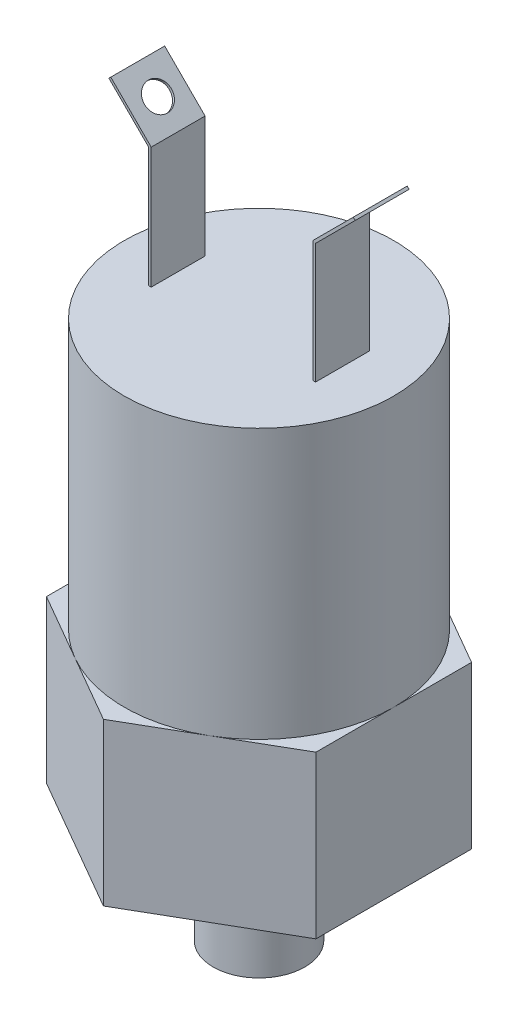
ISO-10303-21;
HEADER;
FILE_DESCRIPTION(('STEP AP214'),'2;1');
FILE_NAME('part.step','',(''),(''),'','','');
FILE_SCHEMA(('AUTOMOTIVE_DESIGN { 1 0 10303 214 1 1 1 1 }'));
ENDSEC;
DATA;
#1=APPLICATION_CONTEXT('core data for automotive mechanical design processes');
#2=APPLICATION_PROTOCOL_DEFINITION('international standard','automotive_design',2000,#1);
#3=PRODUCT_CONTEXT('',#1,'mechanical');
#4=PRODUCT('Part','Part','',(#3));
#5=PRODUCT_RELATED_PRODUCT_CATEGORY('part','',(#4));
#6=PRODUCT_DEFINITION_FORMATION('','',#4);
#7=PRODUCT_DEFINITION_CONTEXT('part definition',#1,'design');
#8=PRODUCT_DEFINITION('design','',#6,#7);
#9=PRODUCT_DEFINITION_SHAPE('','',#8);
#10=(LENGTH_UNIT() NAMED_UNIT(*) SI_UNIT(.MILLI.,.METRE.));
#11=(NAMED_UNIT(*) PLANE_ANGLE_UNIT() SI_UNIT($,.RADIAN.));
#12=(NAMED_UNIT(*) SI_UNIT($,.STERADIAN.) SOLID_ANGLE_UNIT());
#13=UNCERTAINTY_MEASURE_WITH_UNIT(LENGTH_MEASURE(1.E-05),#10,'distance_accuracy_value','');
#14=(GEOMETRIC_REPRESENTATION_CONTEXT(3) GLOBAL_UNCERTAINTY_ASSIGNED_CONTEXT((#13)) GLOBAL_UNIT_ASSIGNED_CONTEXT((#10,
#11,#12)) REPRESENTATION_CONTEXT('',''));
#15=CARTESIAN_POINT('',(0.,0.,0.));
#16=DIRECTION('',(0.,0.,1.));
#17=DIRECTION('',(1.,0.,0.));
#18=AXIS2_PLACEMENT_3D('',#15,#16,#17);
#19=CARTESIAN_POINT('',(0.,50.8,0.));
#20=DIRECTION('',(0.,1.,0.));
#21=DIRECTION('',(0.,0.,1.));
#22=AXIS2_PLACEMENT_3D('',#19,#20,#21);
#23=PLANE('',#22);
#24=CARTESIAN_POINT('',(0.,50.8,0.));
#25=DIRECTION('',(0.,1.,0.));
#26=DIRECTION('',(0.,0.,1.));
#27=AXIS2_PLACEMENT_3D('',#24,#25,#26);
#28=CIRCLE('',#27,12.7);
#29=CARTESIAN_POINT('',(0.,50.8,12.7));
#30=VERTEX_POINT('',#29);
#31=EDGE_CURVE('E284',#30,#30,#28,.T.);
#32=ORIENTED_EDGE('',*,*,#31,.T.);
#33=EDGE_LOOP('',(#32));
#34=FACE_BOUND('',#33,.T.);
#35=DIRECTION('',(0.,0.,-1.));
#36=VECTOR('',#35,1.);
#37=CARTESIAN_POINT('',(7.874,50.8,2.54));
#38=LINE('',#37,#36);
#39=CARTESIAN_POINT('',(7.874,50.8,2.54));
#40=VERTEX_POINT('',#39);
#41=CARTESIAN_POINT('',(7.874,50.8,-2.54));
#42=VERTEX_POINT('',#41);
#43=EDGE_CURVE('E273',#40,#42,#38,.T.);
#44=ORIENTED_EDGE('',*,*,#43,.F.);
#45=DIRECTION('',(-1.,0.,0.));
#46=VECTOR('',#45,1.);
#47=CARTESIAN_POINT('',(7.874,50.8,2.54));
#48=LINE('',#47,#46);
#49=CARTESIAN_POINT('',(7.62,50.8,2.54));
#50=VERTEX_POINT('',#49);
#51=EDGE_CURVE('E251',#40,#50,#48,.T.);
#52=ORIENTED_EDGE('',*,*,#51,.T.);
#53=DIRECTION('',(0.,0.,-1.));
#54=VECTOR('',#53,1.);
#55=CARTESIAN_POINT('',(7.62,50.8,2.54));
#56=LINE('',#55,#54);
#57=CARTESIAN_POINT('',(7.62,50.8,-2.54));
#58=VERTEX_POINT('',#57);
#59=EDGE_CURVE('E276',#50,#58,#56,.T.);
#60=ORIENTED_EDGE('',*,*,#59,.T.);
#61=DIRECTION('',(-1.,0.,0.));
#62=VECTOR('',#61,1.);
#63=CARTESIAN_POINT('',(7.874,50.8,-2.54));
#64=LINE('',#63,#62);
#65=EDGE_CURVE('E267',#42,#58,#64,.T.);
#66=ORIENTED_EDGE('',*,*,#65,.F.);
#67=EDGE_LOOP('',(#44,#52,#60,#66));
#68=FACE_BOUND('',#67,.T.);
#69=DIRECTION('',(0.,0.,-1.));
#70=VECTOR('',#69,1.);
#71=CARTESIAN_POINT('',(-7.62,50.8,2.54));
#72=LINE('',#71,#70);
#73=CARTESIAN_POINT('',(-7.62,50.8,2.54));
#74=VERTEX_POINT('',#73);
#75=CARTESIAN_POINT('',(-7.62,50.8,-2.54));
#76=VERTEX_POINT('',#75);
#77=EDGE_CURVE('E58',#74,#76,#72,.T.);
#78=ORIENTED_EDGE('',*,*,#77,.F.);
#79=DIRECTION('',(1.,0.,0.));
#80=VECTOR('',#79,1.);
#81=CARTESIAN_POINT('',(-7.874,50.8,2.54));
#82=LINE('',#81,#80);
#83=CARTESIAN_POINT('',(-7.874,50.8,2.54));
#84=VERTEX_POINT('',#83);
#85=EDGE_CURVE('E53',#84,#74,#82,.T.);
#86=ORIENTED_EDGE('',*,*,#85,.F.);
#87=DIRECTION('',(0.,0.,-1.));
#88=VECTOR('',#87,1.);
#89=CARTESIAN_POINT('',(-7.874,50.8,2.54));
#90=LINE('',#89,#88);
#91=CARTESIAN_POINT('',(-7.874,50.8,-2.54));
#92=VERTEX_POINT('',#91);
#93=EDGE_CURVE('E190',#84,#92,#90,.T.);
#94=ORIENTED_EDGE('',*,*,#93,.T.);
#95=DIRECTION('',(1.,0.,0.));
#96=VECTOR('',#95,1.);
#97=CARTESIAN_POINT('',(-7.874,50.8,-2.54));
#98=LINE('',#97,#96);
#99=EDGE_CURVE('E216',#92,#76,#98,.T.);
#100=ORIENTED_EDGE('',*,*,#99,.T.);
#101=EDGE_LOOP('',(#78,#86,#94,#100));
#102=FACE_BOUND('',#101,.T.);
#103=ADVANCED_FACE('F35',(#34,#68,#102),#23,.T.);
#104=CARTESIAN_POINT('',(0.,25.4,0.));
#105=DIRECTION('',(0.,1.,0.));
#106=DIRECTION('',(0.,0.,1.));
#107=AXIS2_PLACEMENT_3D('',#104,#105,#106);
#108=PLANE('',#107);
#109=CARTESIAN_POINT('',(0.,25.4,0.));
#110=DIRECTION('',(0.,1.,0.));
#111=DIRECTION('',(0.,0.,1.));
#112=AXIS2_PLACEMENT_3D('',#109,#110,#111);
#113=CIRCLE('',#112,12.7);
#114=CARTESIAN_POINT('',(6.35,25.4,10.9985226280624));
#115=VERTEX_POINT('',#114);
#116=CARTESIAN_POINT('',(12.7,25.4,0.));
#117=VERTEX_POINT('',#116);
#118=EDGE_CURVE('E46',#115,#117,#113,.T.);
#119=ORIENTED_EDGE('',*,*,#118,.F.);
#120=DIRECTION('',(0.866025403784439,0.,-0.5));
#121=VECTOR('',#120,1.);
#122=CARTESIAN_POINT('',(0.,25.4,14.6646968374165));
#123=LINE('',#122,#121);
#124=CARTESIAN_POINT('',(12.7,25.4,7.33234841870824));
#125=VERTEX_POINT('',#124);
#126=EDGE_CURVE('E306',#115,#125,#123,.T.);
#127=ORIENTED_EDGE('',*,*,#126,.T.);
#128=DIRECTION('',(0.,0.,-1.));
#129=VECTOR('',#128,1.);
#130=CARTESIAN_POINT('',(12.7,25.4,7.33234841870824));
#131=LINE('',#130,#129);
#132=EDGE_CURVE('E310',#125,#117,#131,.T.);
#133=ORIENTED_EDGE('',*,*,#132,.T.);
#134=EDGE_LOOP('',(#119,#127,#133));
#135=FACE_BOUND('',#134,.T.);
#136=ADVANCED_FACE('F365',(#135),#108,.T.);
#137=CARTESIAN_POINT('',(6.35,25.4,-10.9985226280624));
#138=VERTEX_POINT('',#137);
#139=EDGE_CURVE('E11',#117,#138,#113,.T.);
#140=ORIENTED_EDGE('',*,*,#139,.F.);
#141=CARTESIAN_POINT('',(12.7,25.4,-7.33234841870825));
#142=VERTEX_POINT('',#141);
#143=EDGE_CURVE('E309',#117,#142,#131,.T.);
#144=ORIENTED_EDGE('',*,*,#143,.T.);
#145=DIRECTION('',(-0.866025403784439,0.,-0.5));
#146=VECTOR('',#145,1.);
#147=CARTESIAN_POINT('',(12.7,25.4,-7.33234841870825));
#148=LINE('',#147,#146);
#149=EDGE_CURVE('E290',#142,#138,#148,.T.);
#150=ORIENTED_EDGE('',*,*,#149,.T.);
#151=EDGE_LOOP('',(#140,#144,#150));
#152=FACE_BOUND('',#151,.T.);
#153=ADVANCED_FACE('F371',(#152),#108,.T.);
#154=CARTESIAN_POINT('',(-6.35,25.4,-10.9985226280624));
#155=VERTEX_POINT('',#154);
#156=EDGE_CURVE('E44',#138,#155,#113,.T.);
#157=ORIENTED_EDGE('',*,*,#156,.F.);
#158=CARTESIAN_POINT('',(0.,25.4,-14.6646968374165));
#159=VERTEX_POINT('',#158);
#160=EDGE_CURVE('E294',#138,#159,#148,.T.);
#161=ORIENTED_EDGE('',*,*,#160,.T.);
#162=DIRECTION('',(-0.866025403784438,0.,0.5));
#163=VECTOR('',#162,1.);
#164=CARTESIAN_POINT('',(0.,25.4,-14.6646968374165));
#165=LINE('',#164,#163);
#166=EDGE_CURVE('E295',#159,#155,#165,.T.);
#167=ORIENTED_EDGE('',*,*,#166,.T.);
#168=EDGE_LOOP('',(#157,#161,#167));
#169=FACE_BOUND('',#168,.T.);
#170=ADVANCED_FACE('F437',(#169),#108,.T.);
#171=CARTESIAN_POINT('',(-12.7,25.4,0.));
#172=VERTEX_POINT('',#171);
#173=EDGE_CURVE('E434',#155,#172,#113,.T.);
#174=ORIENTED_EDGE('',*,*,#173,.F.);
#175=CARTESIAN_POINT('',(-12.7,25.4,-7.33234841870824));
#176=VERTEX_POINT('',#175);
#177=EDGE_CURVE('E293',#155,#176,#165,.T.);
#178=ORIENTED_EDGE('',*,*,#177,.T.);
#179=DIRECTION('',(0.,0.,1.));
#180=VECTOR('',#179,1.);
#181=CARTESIAN_POINT('',(-12.7,25.4,-7.33234841870824));
#182=LINE('',#181,#180);
#183=EDGE_CURVE('E299',#176,#172,#182,.T.);
#184=ORIENTED_EDGE('',*,*,#183,.T.);
#185=EDGE_LOOP('',(#174,#178,#184));
#186=FACE_BOUND('',#185,.T.);
#187=ADVANCED_FACE('F447',(#186),#108,.T.);
#188=CARTESIAN_POINT('',(-6.35,25.4,10.9985226280624));
#189=VERTEX_POINT('',#188);
#190=EDGE_CURVE('E347',#172,#189,#113,.T.);
#191=ORIENTED_EDGE('',*,*,#190,.F.);
#192=CARTESIAN_POINT('',(-12.7,25.4,7.33234841870825));
#193=VERTEX_POINT('',#192);
#194=EDGE_CURVE('E298',#172,#193,#182,.T.);
#195=ORIENTED_EDGE('',*,*,#194,.T.);
#196=DIRECTION('',(0.866025403784439,0.,0.5));
#197=VECTOR('',#196,1.);
#198=CARTESIAN_POINT('',(-12.7,25.4,7.33234841870825));
#199=LINE('',#198,#197);
#200=EDGE_CURVE('E303',#193,#189,#199,.T.);
#201=ORIENTED_EDGE('',*,*,#200,.T.);
#202=EDGE_LOOP('',(#191,#195,#201));
#203=FACE_BOUND('',#202,.T.);
#204=ADVANCED_FACE('F362',(#203),#108,.T.);
#205=CARTESIAN_POINT('',(0.,10.16,0.));
#206=DIRECTION('',(0.,-1.,0.));
#207=DIRECTION('',(0.,0.,-1.));
#208=AXIS2_PLACEMENT_3D('',#205,#206,#207);
#209=CYLINDRICAL_SURFACE('',#208,4.318);
#210=CARTESIAN_POINT('',(0.,10.16,0.));
#211=DIRECTION('',(0.,1.,0.));
#212=DIRECTION('',(0.,0.,1.));
#213=AXIS2_PLACEMENT_3D('',#210,#211,#212);
#214=CIRCLE('',#213,4.318);
#215=CARTESIAN_POINT('',(0.,10.16,4.318));
#216=VERTEX_POINT('',#215);
#217=EDGE_CURVE('E342',#216,#216,#214,.T.);
#218=ORIENTED_EDGE('',*,*,#217,.F.);
#219=EDGE_LOOP('',(#218));
#220=FACE_BOUND('',#219,.T.);
#221=CARTESIAN_POINT('',(0.,0.,0.));
#222=DIRECTION('',(0.,1.,0.));
#223=DIRECTION('',(0.,0.,1.));
#224=AXIS2_PLACEMENT_3D('',#221,#222,#223);
#225=CIRCLE('',#224,4.318);
#226=CARTESIAN_POINT('',(0.,0.,4.318));
#227=VERTEX_POINT('',#226);
#228=EDGE_CURVE('E39',#227,#227,#225,.T.);
#229=ORIENTED_EDGE('',*,*,#228,.T.);
#230=EDGE_LOOP('',(#229));
#231=FACE_BOUND('',#230,.T.);
#232=ADVANCED_FACE('F37',(#220,#231),#209,.T.);
#233=CARTESIAN_POINT('',(0.,0.,0.));
#234=DIRECTION('',(0.,1.,0.));
#235=DIRECTION('',(0.,0.,1.));
#236=AXIS2_PLACEMENT_3D('',#233,#234,#235);
#237=PLANE('',#236);
#238=ORIENTED_EDGE('',*,*,#228,.F.);
#239=EDGE_LOOP('',(#238));
#240=FACE_BOUND('',#239,.T.);
#241=ADVANCED_FACE('F352',(#240),#237,.F.);
#242=CARTESIAN_POINT('',(12.7,25.4,-7.33234841870825));
#243=DIRECTION('',(-0.5,0.,0.866025403784439));
#244=DIRECTION('',(0.866025403784439,0.,0.5));
#245=AXIS2_PLACEMENT_3D('',#242,#243,#244);
#246=PLANE('',#245);
#247=DIRECTION('',(-0.866025403784439,0.,-0.5));
#248=VECTOR('',#247,1.);
#249=CARTESIAN_POINT('',(12.7,10.16,-7.33234841870825));
#250=LINE('',#249,#248);
#251=CARTESIAN_POINT('',(12.7,10.16,-7.33234841870825));
#252=VERTEX_POINT('',#251);
#253=CARTESIAN_POINT('',(0.,10.16,-14.6646968374165));
#254=VERTEX_POINT('',#253);
#255=EDGE_CURVE('E286',#252,#254,#250,.T.);
#256=ORIENTED_EDGE('',*,*,#255,.T.);
#257=DIRECTION('',(0.,-1.,0.));
#258=VECTOR('',#257,1.);
#259=CARTESIAN_POINT('',(0.,25.4,-14.6646968374165));
#260=LINE('',#259,#258);
#261=EDGE_CURVE('E340',#159,#254,#260,.T.);
#262=ORIENTED_EDGE('',*,*,#261,.F.);
#263=ORIENTED_EDGE('',*,*,#160,.F.);
#264=ORIENTED_EDGE('',*,*,#149,.F.);
#265=DIRECTION('',(0.,-1.,0.));
#266=VECTOR('',#265,1.);
#267=CARTESIAN_POINT('',(12.7,25.4,-7.33234841870825));
#268=LINE('',#267,#266);
#269=EDGE_CURVE('E313',#142,#252,#268,.T.);
#270=ORIENTED_EDGE('',*,*,#269,.T.);
#271=EDGE_LOOP('',(#256,#262,#263,#264,#270));
#272=FACE_BOUND('',#271,.T.);
#273=ADVANCED_FACE('F354',(#272),#246,.F.);
#274=CARTESIAN_POINT('',(0.,25.4,-14.6646968374165));
#275=DIRECTION('',(0.5,0.,0.866025403784438));
#276=DIRECTION('',(0.866025403784439,0.,-0.5));
#277=AXIS2_PLACEMENT_3D('',#274,#275,#276);
#278=PLANE('',#277);
#279=DIRECTION('',(-0.866025403784438,0.,0.5));
#280=VECTOR('',#279,1.);
#281=CARTESIAN_POINT('',(0.,10.16,-14.6646968374165));
#282=LINE('',#281,#280);
#283=CARTESIAN_POINT('',(-12.7,10.16,-7.33234841870824));
#284=VERTEX_POINT('',#283);
#285=EDGE_CURVE('E316',#254,#284,#282,.T.);
#286=ORIENTED_EDGE('',*,*,#285,.T.);
#287=DIRECTION('',(0.,-1.,0.));
#288=VECTOR('',#287,1.);
#289=CARTESIAN_POINT('',(-12.7,25.4,-7.33234841870824));
#290=LINE('',#289,#288);
#291=EDGE_CURVE('E337',#176,#284,#290,.T.);
#292=ORIENTED_EDGE('',*,*,#291,.F.);
#293=ORIENTED_EDGE('',*,*,#177,.F.);
#294=ORIENTED_EDGE('',*,*,#166,.F.);
#295=ORIENTED_EDGE('',*,*,#261,.T.);
#296=EDGE_LOOP('',(#286,#292,#293,#294,#295));
#297=FACE_BOUND('',#296,.T.);
#298=ADVANCED_FACE('F359',(#297),#278,.F.);
#299=CARTESIAN_POINT('',(-12.7,25.4,-7.33234841870824));
#300=DIRECTION('',(1.,0.,0.));
#301=DIRECTION('',(0.,0.,-1.));
#302=AXIS2_PLACEMENT_3D('',#299,#300,#301);
#303=PLANE('',#302);
#304=DIRECTION('',(0.,0.,1.));
#305=VECTOR('',#304,1.);
#306=CARTESIAN_POINT('',(-12.7,10.16,-7.33234841870824));
#307=LINE('',#306,#305);
#308=CARTESIAN_POINT('',(-12.7,10.16,7.33234841870825));
#309=VERTEX_POINT('',#308);
#310=EDGE_CURVE('E318',#284,#309,#307,.T.);
#311=ORIENTED_EDGE('',*,*,#310,.T.);
#312=DIRECTION('',(0.,-1.,0.));
#313=VECTOR('',#312,1.);
#314=CARTESIAN_POINT('',(-12.7,25.4,7.33234841870825));
#315=LINE('',#314,#313);
#316=EDGE_CURVE('E334',#193,#309,#315,.T.);
#317=ORIENTED_EDGE('',*,*,#316,.F.);
#318=ORIENTED_EDGE('',*,*,#194,.F.);
#319=ORIENTED_EDGE('',*,*,#183,.F.);
#320=ORIENTED_EDGE('',*,*,#291,.T.);
#321=EDGE_LOOP('',(#311,#317,#318,#319,#320));
#322=FACE_BOUND('',#321,.T.);
#323=ADVANCED_FACE('F400',(#322),#303,.F.);
#324=CARTESIAN_POINT('',(-12.7,25.4,7.33234841870825));
#325=DIRECTION('',(0.5,0.,-0.866025403784439));
#326=DIRECTION('',(-0.866025403784439,0.,-0.5));
#327=AXIS2_PLACEMENT_3D('',#324,#325,#326);
#328=PLANE('',#327);
#329=DIRECTION('',(0.866025403784439,0.,0.5));
#330=VECTOR('',#329,1.);
#331=CARTESIAN_POINT('',(-12.7,10.16,7.33234841870825));
#332=LINE('',#331,#330);
#333=CARTESIAN_POINT('',(0.,10.16,14.6646968374165));
#334=VERTEX_POINT('',#333);
#335=EDGE_CURVE('E320',#309,#334,#332,.T.);
#336=ORIENTED_EDGE('',*,*,#335,.T.);
#337=DIRECTION('',(0.,-1.,0.));
#338=VECTOR('',#337,1.);
#339=CARTESIAN_POINT('',(0.,25.4,14.6646968374165));
#340=LINE('',#339,#338);
#341=CARTESIAN_POINT('',(0.,25.4,14.6646968374165));
#342=VERTEX_POINT('',#341);
#343=EDGE_CURVE('E331',#342,#334,#340,.T.);
#344=ORIENTED_EDGE('',*,*,#343,.F.);
#345=EDGE_CURVE('E302',#189,#342,#199,.T.);
#346=ORIENTED_EDGE('',*,*,#345,.F.);
#347=ORIENTED_EDGE('',*,*,#200,.F.);
#348=ORIENTED_EDGE('',*,*,#316,.T.);
#349=EDGE_LOOP('',(#336,#344,#346,#347,#348));
#350=FACE_BOUND('',#349,.T.);
#351=ADVANCED_FACE('F396',(#350),#328,.F.);
#352=CARTESIAN_POINT('',(0.,25.4,14.6646968374165));
#353=DIRECTION('',(-0.5,0.,-0.866025403784439));
#354=DIRECTION('',(-0.866025403784439,0.,0.5));
#355=AXIS2_PLACEMENT_3D('',#352,#353,#354);
#356=PLANE('',#355);
#357=DIRECTION('',(0.866025403784439,0.,-0.5));
#358=VECTOR('',#357,1.);
#359=CARTESIAN_POINT('',(0.,10.16,14.6646968374165));
#360=LINE('',#359,#358);
#361=CARTESIAN_POINT('',(12.7,10.16,7.33234841870824));
#362=VERTEX_POINT('',#361);
#363=EDGE_CURVE('E322',#334,#362,#360,.T.);
#364=ORIENTED_EDGE('',*,*,#363,.T.);
#365=DIRECTION('',(0.,-1.,0.));
#366=VECTOR('',#365,1.);
#367=CARTESIAN_POINT('',(12.7,25.4,7.33234841870824));
#368=LINE('',#367,#366);
#369=EDGE_CURVE('E328',#125,#362,#368,.T.);
#370=ORIENTED_EDGE('',*,*,#369,.F.);
#371=ORIENTED_EDGE('',*,*,#126,.F.);
#372=EDGE_CURVE('E307',#342,#115,#123,.T.);
#373=ORIENTED_EDGE('',*,*,#372,.F.);
#374=ORIENTED_EDGE('',*,*,#343,.T.);
#375=EDGE_LOOP('',(#364,#370,#371,#373,#374));
#376=FACE_BOUND('',#375,.T.);
#377=ADVANCED_FACE('F392',(#376),#356,.F.);
#378=CARTESIAN_POINT('',(12.7,25.4,7.33234841870824));
#379=DIRECTION('',(-1.,0.,0.));
#380=DIRECTION('',(0.,0.,1.));
#381=AXIS2_PLACEMENT_3D('',#378,#379,#380);
#382=PLANE('',#381);
#383=DIRECTION('',(0.,0.,-1.));
#384=VECTOR('',#383,1.);
#385=CARTESIAN_POINT('',(12.7,10.16,7.33234841870824));
#386=LINE('',#385,#384);
#387=EDGE_CURVE('E324',#362,#252,#386,.T.);
#388=ORIENTED_EDGE('',*,*,#387,.T.);
#389=ORIENTED_EDGE('',*,*,#269,.F.);
#390=ORIENTED_EDGE('',*,*,#143,.F.);
#391=ORIENTED_EDGE('',*,*,#132,.F.);
#392=ORIENTED_EDGE('',*,*,#369,.T.);
#393=EDGE_LOOP('',(#388,#389,#390,#391,#392));
#394=FACE_BOUND('',#393,.T.);
#395=ADVANCED_FACE('F386',(#394),#382,.F.);
#396=EDGE_CURVE('E289',#189,#115,#113,.T.);
#397=ORIENTED_EDGE('',*,*,#396,.F.);
#398=ORIENTED_EDGE('',*,*,#345,.T.);
#399=ORIENTED_EDGE('',*,*,#372,.T.);
#400=EDGE_LOOP('',(#397,#398,#399));
#401=FACE_BOUND('',#400,.T.);
#402=ADVANCED_FACE('F374',(#401),#108,.T.);
#403=CARTESIAN_POINT('',(0.,10.16,0.));
#404=DIRECTION('',(0.,1.,0.));
#405=DIRECTION('',(0.,0.,1.));
#406=AXIS2_PLACEMENT_3D('',#403,#404,#405);
#407=PLANE('',#406);
#408=ORIENTED_EDGE('',*,*,#217,.T.);
#409=EDGE_LOOP('',(#408));
#410=FACE_BOUND('',#409,.T.);
#411=ORIENTED_EDGE('',*,*,#255,.F.);
#412=ORIENTED_EDGE('',*,*,#387,.F.);
#413=ORIENTED_EDGE('',*,*,#363,.F.);
#414=ORIENTED_EDGE('',*,*,#335,.F.);
#415=ORIENTED_EDGE('',*,*,#310,.F.);
#416=ORIENTED_EDGE('',*,*,#285,.F.);
#417=EDGE_LOOP('',(#411,#412,#413,#414,#415,#416));
#418=FACE_BOUND('',#417,.T.);
#419=ADVANCED_FACE('F382',(#410,#418),#407,.F.);
#420=CARTESIAN_POINT('',(0.,50.8,0.));
#421=DIRECTION('',(0.,-1.,0.));
#422=DIRECTION('',(0.,0.,-1.));
#423=AXIS2_PLACEMENT_3D('',#420,#421,#422);
#424=CYLINDRICAL_SURFACE('',#423,12.7);
#425=ORIENTED_EDGE('',*,*,#31,.F.);
#426=EDGE_LOOP('',(#425));
#427=FACE_BOUND('',#426,.T.);
#428=ORIENTED_EDGE('',*,*,#118,.T.);
#429=ORIENTED_EDGE('',*,*,#139,.T.);
#430=ORIENTED_EDGE('',*,*,#156,.T.);
#431=ORIENTED_EDGE('',*,*,#173,.T.);
#432=ORIENTED_EDGE('',*,*,#190,.T.);
#433=ORIENTED_EDGE('',*,*,#396,.T.);
#434=EDGE_LOOP('',(#428,#429,#430,#431,#432,#433));
#435=FACE_BOUND('',#434,.T.);
#436=ADVANCED_FACE('F380',(#427,#435),#424,.T.);
#437=CARTESIAN_POINT('',(7.79960512242138,62.0503948775786,2.54));
#438=DIRECTION('',(-0.707106781186545,0.70710678118655,0.));
#439=DIRECTION('',(-0.70710678118655,-0.707106781186545,0.));
#440=AXIS2_PLACEMENT_3D('',#437,#438,#439);
#441=PLANE('',#440);
#442=CARTESIAN_POINT('',(9.70460512242139,63.9553948775786,0.));
#443=DIRECTION('',(-0.707106781186545,0.70710678118655,0.));
#444=DIRECTION('',(-0.70710678118655,-0.707106781186545,0.));
#445=AXIS2_PLACEMENT_3D('',#442,#443,#444);
#446=CIRCLE('',#445,1.27);
#447=CARTESIAN_POINT('',(8.80657951031448,63.0573692654717,0.));
#448=VERTEX_POINT('',#447);
#449=EDGE_CURVE('E235',#448,#448,#446,.F.);
#450=ORIENTED_EDGE('',*,*,#449,.F.);
#451=EDGE_LOOP('',(#450));
#452=FACE_BOUND('',#451,.T.);
#453=DIRECTION('',(0.70710678118655,0.707106781186545,0.));
#454=VECTOR('',#453,1.);
#455=CARTESIAN_POINT('',(7.79960512242138,62.0503948775786,-2.54));
#456=LINE('',#455,#454);
#457=CARTESIAN_POINT('',(7.874,62.1247897551572,-2.54));
#458=VERTEX_POINT('',#457);
#459=CARTESIAN_POINT('',(11.6096051224214,65.8603948775786,-2.54));
#460=VERTEX_POINT('',#459);
#461=EDGE_CURVE('E238',#458,#460,#456,.T.);
#462=ORIENTED_EDGE('',*,*,#461,.T.);
#463=DIRECTION('',(0.,0.,-1.));
#464=VECTOR('',#463,1.);
#465=CARTESIAN_POINT('',(11.6096051224214,65.8603948775786,2.54));
#466=LINE('',#465,#464);
#467=CARTESIAN_POINT('',(11.6096051224214,65.8603948775786,2.54));
#468=VERTEX_POINT('',#467);
#469=EDGE_CURVE('E282',#468,#460,#466,.T.);
#470=ORIENTED_EDGE('',*,*,#469,.F.);
#471=DIRECTION('',(0.70710678118655,0.707106781186545,0.));
#472=VECTOR('',#471,1.);
#473=CARTESIAN_POINT('',(7.79960512242138,62.0503948775786,2.54));
#474=LINE('',#473,#472);
#475=CARTESIAN_POINT('',(7.874,62.1247897551572,2.54));
#476=VERTEX_POINT('',#475);
#477=EDGE_CURVE('E239',#476,#468,#474,.T.);
#478=ORIENTED_EDGE('',*,*,#477,.F.);
#479=DIRECTION('',(0.,0.,-1.));
#480=VECTOR('',#479,1.);
#481=CARTESIAN_POINT('',(7.874,62.1247897551572,2.54));
#482=LINE('',#481,#480);
#483=EDGE_CURVE('E255',#476,#458,#482,.T.);
#484=ORIENTED_EDGE('',*,*,#483,.T.);
#485=EDGE_LOOP('',(#462,#470,#478,#484));
#486=FACE_BOUND('',#485,.T.);
#487=ADVANCED_FACE('F378',(#452,#486),#441,.F.);
#488=CARTESIAN_POINT('',(11.43,66.04,2.54));
#489=DIRECTION('',(0.707106781186537,0.707106781186558,0.));
#490=DIRECTION('',(-0.707106781186558,0.707106781186537,0.));
#491=AXIS2_PLACEMENT_3D('',#488,#489,#490);
#492=PLANE('',#491);
#493=DIRECTION('',(0.707106781186558,-0.707106781186537,0.));
#494=VECTOR('',#493,1.);
#495=CARTESIAN_POINT('',(11.43,66.04,-2.54));
#496=LINE('',#495,#494);
#497=CARTESIAN_POINT('',(11.43,66.04,-2.54));
#498=VERTEX_POINT('',#497);
#499=EDGE_CURVE('E258',#498,#460,#496,.T.);
#500=ORIENTED_EDGE('',*,*,#499,.F.);
#501=DIRECTION('',(0.,0.,-1.));
#502=VECTOR('',#501,1.);
#503=CARTESIAN_POINT('',(11.43,66.04,2.54));
#504=LINE('',#503,#502);
#505=CARTESIAN_POINT('',(11.43,66.04,2.54));
#506=VERTEX_POINT('',#505);
#507=EDGE_CURVE('E280',#506,#498,#504,.T.);
#508=ORIENTED_EDGE('',*,*,#507,.F.);
#509=DIRECTION('',(0.707106781186558,-0.707106781186537,0.));
#510=VECTOR('',#509,1.);
#511=CARTESIAN_POINT('',(11.43,66.04,2.54));
#512=LINE('',#511,#510);
#513=EDGE_CURVE('E241',#506,#468,#512,.T.);
#514=ORIENTED_EDGE('',*,*,#513,.T.);
#515=ORIENTED_EDGE('',*,*,#469,.T.);
#516=EDGE_LOOP('',(#500,#508,#514,#515));
#517=FACE_BOUND('',#516,.T.);
#518=ADVANCED_FACE('F574',(#517),#492,.T.);
#519=CARTESIAN_POINT('',(7.62,62.23,2.54));
#520=DIRECTION('',(-0.707106781186545,0.70710678118655,0.));
#521=DIRECTION('',(-0.70710678118655,-0.707106781186545,0.));
#522=AXIS2_PLACEMENT_3D('',#519,#520,#521);
#523=PLANE('',#522);
#524=CARTESIAN_POINT('',(9.525,64.135,0.));
#525=DIRECTION('',(-0.707106781186545,0.70710678118655,0.));
#526=DIRECTION('',(-0.70710678118655,-0.707106781186545,0.));
#527=AXIS2_PLACEMENT_3D('',#524,#525,#526);
#528=CIRCLE('',#527,1.27);
#529=CARTESIAN_POINT('',(8.62697438789307,63.2369743878931,0.));
#530=VERTEX_POINT('',#529);
#531=EDGE_CURVE('E189',#530,#530,#528,.T.);
#532=ORIENTED_EDGE('',*,*,#531,.F.);
#533=EDGE_LOOP('',(#532));
#534=FACE_BOUND('',#533,.T.);
#535=DIRECTION('',(0.70710678118655,0.707106781186545,0.));
#536=VECTOR('',#535,1.);
#537=CARTESIAN_POINT('',(7.62,62.23,-2.54));
#538=LINE('',#537,#536);
#539=CARTESIAN_POINT('',(7.62,62.23,-2.54));
#540=VERTEX_POINT('',#539);
#541=EDGE_CURVE('E261',#540,#498,#538,.T.);
#542=ORIENTED_EDGE('',*,*,#541,.F.);
#543=DIRECTION('',(0.,0.,-1.));
#544=VECTOR('',#543,1.);
#545=CARTESIAN_POINT('',(7.62,62.23,2.54));
#546=LINE('',#545,#544);
#547=CARTESIAN_POINT('',(7.62,62.23,2.54));
#548=VERTEX_POINT('',#547);
#549=EDGE_CURVE('E278',#548,#540,#546,.T.);
#550=ORIENTED_EDGE('',*,*,#549,.F.);
#551=DIRECTION('',(0.70710678118655,0.707106781186545,0.));
#552=VECTOR('',#551,1.);
#553=CARTESIAN_POINT('',(7.62,62.23,2.54));
#554=LINE('',#553,#552);
#555=EDGE_CURVE('E245',#548,#506,#554,.T.);
#556=ORIENTED_EDGE('',*,*,#555,.T.);
#557=ORIENTED_EDGE('',*,*,#507,.T.);
#558=EDGE_LOOP('',(#542,#550,#556,#557));
#559=FACE_BOUND('',#558,.T.);
#560=ADVANCED_FACE('F571',(#534,#559),#523,.T.);
#561=CARTESIAN_POINT('',(7.62,50.8,2.54));
#562=DIRECTION('',(-1.,0.,0.));
#563=DIRECTION('',(0.,-1.,0.));
#564=AXIS2_PLACEMENT_3D('',#561,#562,#563);
#565=PLANE('',#564);
#566=DIRECTION('',(0.,1.,0.));
#567=VECTOR('',#566,1.);
#568=CARTESIAN_POINT('',(7.62,50.8,-2.54));
#569=LINE('',#568,#567);
#570=EDGE_CURVE('E264',#58,#540,#569,.T.);
#571=ORIENTED_EDGE('',*,*,#570,.F.);
#572=ORIENTED_EDGE('',*,*,#59,.F.);
#573=DIRECTION('',(0.,1.,0.));
#574=VECTOR('',#573,1.);
#575=CARTESIAN_POINT('',(7.62,50.8,2.54));
#576=LINE('',#575,#574);
#577=EDGE_CURVE('E248',#50,#548,#576,.T.);
#578=ORIENTED_EDGE('',*,*,#577,.T.);
#579=ORIENTED_EDGE('',*,*,#549,.T.);
#580=EDGE_LOOP('',(#571,#572,#578,#579));
#581=FACE_BOUND('',#580,.T.);
#582=ADVANCED_FACE('F567',(#581),#565,.T.);
#583=CARTESIAN_POINT('',(7.874,50.8,2.54));
#584=DIRECTION('',(-1.,0.,0.));
#585=DIRECTION('',(0.,-1.,0.));
#586=AXIS2_PLACEMENT_3D('',#583,#584,#585);
#587=PLANE('',#586);
#588=DIRECTION('',(0.,1.,0.));
#589=VECTOR('',#588,1.);
#590=CARTESIAN_POINT('',(7.874,50.8,-2.54));
#591=LINE('',#590,#589);
#592=EDGE_CURVE('E242',#42,#458,#591,.T.);
#593=ORIENTED_EDGE('',*,*,#592,.T.);
#594=ORIENTED_EDGE('',*,*,#483,.F.);
#595=DIRECTION('',(0.,1.,0.));
#596=VECTOR('',#595,1.);
#597=CARTESIAN_POINT('',(7.874,50.8,2.54));
#598=LINE('',#597,#596);
#599=EDGE_CURVE('E253',#40,#476,#598,.T.);
#600=ORIENTED_EDGE('',*,*,#599,.F.);
#601=ORIENTED_EDGE('',*,*,#43,.T.);
#602=EDGE_LOOP('',(#593,#594,#600,#601));
#603=FACE_BOUND('',#602,.T.);
#604=ADVANCED_FACE('F560',(#603),#587,.F.);
#605=CARTESIAN_POINT('',(0.,0.,2.54));
#606=DIRECTION('',(0.,0.,-1.));
#607=DIRECTION('',(-1.,0.,0.));
#608=AXIS2_PLACEMENT_3D('',#605,#606,#607);
#609=PLANE('',#608);
#610=ORIENTED_EDGE('',*,*,#477,.T.);
#611=ORIENTED_EDGE('',*,*,#513,.F.);
#612=ORIENTED_EDGE('',*,*,#555,.F.);
#613=ORIENTED_EDGE('',*,*,#577,.F.);
#614=ORIENTED_EDGE('',*,*,#51,.F.);
#615=ORIENTED_EDGE('',*,*,#599,.T.);
#616=EDGE_LOOP('',(#610,#611,#612,#613,#614,#615));
#617=FACE_BOUND('',#616,.T.);
#618=ADVANCED_FACE('F557',(#617),#609,.F.);
#619=CARTESIAN_POINT('',(0.,0.,-2.54));
#620=DIRECTION('',(0.,0.,-1.));
#621=DIRECTION('',(-1.,0.,0.));
#622=AXIS2_PLACEMENT_3D('',#619,#620,#621);
#623=PLANE('',#622);
#624=ORIENTED_EDGE('',*,*,#461,.F.);
#625=ORIENTED_EDGE('',*,*,#592,.F.);
#626=ORIENTED_EDGE('',*,*,#65,.T.);
#627=ORIENTED_EDGE('',*,*,#570,.T.);
#628=ORIENTED_EDGE('',*,*,#541,.T.);
#629=ORIENTED_EDGE('',*,*,#499,.T.);
#630=EDGE_LOOP('',(#624,#625,#626,#627,#628,#629));
#631=FACE_BOUND('',#630,.T.);
#632=ADVANCED_FACE('F555',(#631),#623,.T.);
#633=CARTESIAN_POINT('',(43.181,30.4789999999998,0.));
#634=DIRECTION('',(-0.707106781186545,0.70710678118655,0.));
#635=DIRECTION('',(-0.70710678118655,-0.707106781186545,0.));
#636=AXIS2_PLACEMENT_3D('',#633,#634,#635);
#637=CYLINDRICAL_SURFACE('',#636,1.27);
#638=CARTESIAN_POINT('',(8.62697438789307,63.2369743878931,0.));
#639=CARTESIAN_POINT('',(8.62884527458496,63.2351035012012,0.));
#640=CARTESIAN_POINT('',(8.63071616127686,63.2332326145093,0.));
#641=CARTESIAN_POINT('',(8.63445793466063,63.2294908411255,0.));
#642=CARTESIAN_POINT('',(8.63632882135252,63.2276199544336,0.));
#643=CARTESIAN_POINT('',(8.6400705947363,63.2238781810499,0.));
#644=CARTESIAN_POINT('',(8.64194148142819,63.222007294358,0.));
#645=CARTESIAN_POINT('',(8.64568325481197,63.2182655209742,0.));
#646=CARTESIAN_POINT('',(8.64755414150386,63.2163946342823,0.));
#647=CARTESIAN_POINT('',(8.65129591488764,63.2126528608985,0.));
#648=CARTESIAN_POINT('',(8.65316680157953,63.2107819742066,0.));
#649=CARTESIAN_POINT('',(8.65690857496331,63.2070402008229,0.));
#650=CARTESIAN_POINT('',(8.6587794616552,63.205169314131,0.));
#651=CARTESIAN_POINT('',(8.66252123503898,63.2014275407472,0.));
#652=CARTESIAN_POINT('',(8.66439212173087,63.1995566540553,0.));
#653=CARTESIAN_POINT('',(8.66813389511465,63.1958148806715,0.));
#654=CARTESIAN_POINT('',(8.67000478180654,63.1939439939796,0.));
#655=CARTESIAN_POINT('',(8.67374655519031,63.1902022205959,0.));
#656=CARTESIAN_POINT('',(8.6756174418822,63.188331333904,0.));
#657=CARTESIAN_POINT('',(8.67935921526598,63.1845895605202,0.));
#658=CARTESIAN_POINT('',(8.68123010195788,63.1827186738283,0.));
#659=CARTESIAN_POINT('',(8.68497187534166,63.1789769004445,0.));
#660=CARTESIAN_POINT('',(8.68684276203354,63.1771060137526,0.));
#661=CARTESIAN_POINT('',(8.69058453541732,63.1733642403688,0.));
#662=CARTESIAN_POINT('',(8.69245542210922,63.171493353677,0.));
#663=CARTESIAN_POINT('',(8.69619719549299,63.1677515802932,0.));
#664=CARTESIAN_POINT('',(8.69806808218488,63.1658806936013,0.));
#665=CARTESIAN_POINT('',(8.70180985556866,63.1621389202175,0.));
#666=CARTESIAN_POINT('',(8.70368074226055,63.1602680335256,0.));
#667=CARTESIAN_POINT('',(8.70742251564433,63.1565262601418,0.));
#668=CARTESIAN_POINT('',(8.70929340233622,63.15465537345,0.));
#669=CARTESIAN_POINT('',(8.71303517572,63.1509136000662,0.));
#670=CARTESIAN_POINT('',(8.71490606241189,63.1490427133743,0.));
#671=CARTESIAN_POINT('',(8.71864783579567,63.1453009399905,0.));
#672=CARTESIAN_POINT('',(8.72051872248755,63.1434300532986,0.));
#673=CARTESIAN_POINT('',(8.72426049587133,63.1396882799148,0.));
#674=CARTESIAN_POINT('',(8.72613138256323,63.137817393223,0.));
#675=CARTESIAN_POINT('',(8.72987315594701,63.1340756198392,0.));
#676=CARTESIAN_POINT('',(8.7317440426389,63.1322047331473,0.));
#677=CARTESIAN_POINT('',(8.73548581602268,63.1284629597635,0.));
#678=CARTESIAN_POINT('',(8.73735670271457,63.1265920730716,0.));
#679=CARTESIAN_POINT('',(8.74109847609834,63.1228502996878,0.));
#680=CARTESIAN_POINT('',(8.74296936279023,63.1209794129959,0.));
#681=CARTESIAN_POINT('',(8.74671113617401,63.1172376396122,0.));
#682=CARTESIAN_POINT('',(8.7485820228659,63.1153667529203,0.));
#683=CARTESIAN_POINT('',(8.75232379624968,63.1116249795365,0.));
#684=CARTESIAN_POINT('',(8.75419468294157,63.1097540928446,0.));
#685=CARTESIAN_POINT('',(8.75793645632535,63.1060123194608,0.));
#686=CARTESIAN_POINT('',(8.75980734301724,63.1041414327689,0.));
#687=CARTESIAN_POINT('',(8.76354911640102,63.1003996593851,0.));
#688=CARTESIAN_POINT('',(8.76542000309291,63.0985287726933,0.));
#689=CARTESIAN_POINT('',(8.76916177647669,63.0947869993095,0.));
#690=CARTESIAN_POINT('',(8.77103266316858,63.0929161126176,0.));
#691=CARTESIAN_POINT('',(8.77477443655236,63.0891743392338,0.));
#692=CARTESIAN_POINT('',(8.77664532324425,63.0873034525419,0.));
#693=CARTESIAN_POINT('',(8.78038709662803,63.0835616791581,0.));
#694=CARTESIAN_POINT('',(8.78225798331992,63.0816907924662,0.));
#695=CARTESIAN_POINT('',(8.78599975670369,63.0779490190825,0.));
#696=CARTESIAN_POINT('',(8.78787064339558,63.0760781323906,0.));
#697=CARTESIAN_POINT('',(8.79161241677937,63.0723363590068,0.));
#698=CARTESIAN_POINT('',(8.79348330347126,63.0704654723149,0.));
#699=CARTESIAN_POINT('',(8.79722507685504,63.0667236989311,0.));
#700=CARTESIAN_POINT('',(8.79909596354692,63.0648528122392,0.));
#701=CARTESIAN_POINT('',(8.8028377369307,63.0611110388555,0.));
#702=CARTESIAN_POINT('',(8.80470862362259,63.0592401521636,0.));
#703=CARTESIAN_POINT('',(8.80657951031448,63.0573692654717,0.));
#704=B_SPLINE_CURVE_WITH_KNOTS('',3,(#638,#639,#640,#641,#642,#643,#644,#645,#646,#647,#648,
#649,#650,#651,#652,#653,#654,#655,#656,#657,#658,#659,#660,#661,#662,#663,#664,#665,#666,#667,
#668,#669,#670,#671,#672,#673,#674,#675,#676,#677,#678,#679,#680,#681,#682,#683,#684,#685,#686,
#687,#688,#689,#690,#691,#692,#693,#694,#695,#696,#697,#698,#699,#700,#701,#702,#703),
.UNSPECIFIED.,.F.,.F.,(4,2,2,2,2,2,2,2,2,2,2,2,2,2,2,2,2,2,2,2,2,2,2,2,2,2,2,2,2,2,2,2,4),(0.,
0.00793749999999732,0.0158750000000045,0.0238125000000116,0.0317500000000089,0.0396875000000013,
0.0476250000000134,0.0555625000000107,0.0635000000000031,0.0714375000000102,0.0793750000000076,
0.0873125000000147,0.095250000000012,0.103187500000014,0.111125000000026,0.119062500000009,
0.127000000000016,0.134937500000023,0.142875000000011,0.150812500000018,0.158750000000025,
0.166687500000017,0.174625000000029,0.182562500000022,0.190500000000029,0.198437500000026,
0.206375000000023,0.214312500000031,0.222250000000038,0.23018750000002,0.238125000000032,
0.246062500000035,0.254000000000032),.UNSPECIFIED.);
#705=EDGE_CURVE('BSEAM495',#530,#448,#704,.T.);
#706=ORIENTED_EDGE('',*,*,#531,.T.);
#707=ORIENTED_EDGE('',*,*,#449,.T.);
#708=ORIENTED_EDGE('',*,*,#705,.T.);
#709=ORIENTED_EDGE('',*,*,#705,.F.);
#710=EDGE_LOOP('',(#706,#708,#707,#709));
#711=FACE_BOUND('',#710,.T.);
#712=ADVANCED_FACE('F495',(#711),#637,.F.);
#713=CARTESIAN_POINT('',(-7.79960512242138,62.0503948775786,2.54));
#714=DIRECTION('',(-0.707106781186545,-0.70710678118655,0.));
#715=DIRECTION('',(0.70710678118655,-0.707106781186545,0.));
#716=AXIS2_PLACEMENT_3D('',#713,#714,#715);
#717=PLANE('',#716);
#718=CARTESIAN_POINT('',(-9.70460512242139,63.9553948775786,0.));
#719=DIRECTION('',(-0.707106781186545,-0.70710678118655,0.));
#720=DIRECTION('',(0.70710678118655,-0.707106781186545,0.));
#721=AXIS2_PLACEMENT_3D('',#718,#719,#720);
#722=CIRCLE('',#721,1.27);
#723=CARTESIAN_POINT('',(-10.6026307345283,64.8534204896855,0.));
#724=VERTEX_POINT('',#723);
#725=EDGE_CURVE('E214',#724,#724,#722,.T.);
#726=ORIENTED_EDGE('',*,*,#725,.F.);
#727=EDGE_LOOP('',(#726));
#728=FACE_BOUND('',#727,.T.);
#729=DIRECTION('',(-0.70710678118655,0.707106781186545,0.));
#730=VECTOR('',#729,1.);
#731=CARTESIAN_POINT('',(-7.79960512242138,62.0503948775786,-2.54));
#732=LINE('',#731,#730);
#733=CARTESIAN_POINT('',(-7.874,62.1247897551572,-2.54));
#734=VERTEX_POINT('',#733);
#735=CARTESIAN_POINT('',(-11.6096051224214,65.8603948775786,-2.54));
#736=VERTEX_POINT('',#735);
#737=EDGE_CURVE('E184',#734,#736,#732,.T.);
#738=ORIENTED_EDGE('',*,*,#737,.F.);
#739=DIRECTION('',(0.,0.,-1.));
#740=VECTOR('',#739,1.);
#741=CARTESIAN_POINT('',(-7.874,62.1247897551572,2.54));
#742=LINE('',#741,#740);
#743=CARTESIAN_POINT('',(-7.874,62.1247897551572,2.54));
#744=VERTEX_POINT('',#743);
#745=EDGE_CURVE('E179',#744,#734,#742,.T.);
#746=ORIENTED_EDGE('',*,*,#745,.F.);
#747=DIRECTION('',(-0.70710678118655,0.707106781186545,0.));
#748=VECTOR('',#747,1.);
#749=CARTESIAN_POINT('',(-7.79960512242138,62.0503948775786,2.54));
#750=LINE('',#749,#748);
#751=CARTESIAN_POINT('',(-11.6096051224214,65.8603948775786,2.54));
#752=VERTEX_POINT('',#751);
#753=EDGE_CURVE('E182',#744,#752,#750,.T.);
#754=ORIENTED_EDGE('',*,*,#753,.T.);
#755=DIRECTION('',(0.,0.,-1.));
#756=VECTOR('',#755,1.);
#757=CARTESIAN_POINT('',(-11.6096051224214,65.8603948775786,2.54));
#758=LINE('',#757,#756);
#759=EDGE_CURVE('E211',#752,#736,#758,.T.);
#760=ORIENTED_EDGE('',*,*,#759,.T.);
#761=EDGE_LOOP('',(#738,#746,#754,#760));
#762=FACE_BOUND('',#761,.T.);
#763=ADVANCED_FACE('F181',(#728,#762),#717,.T.);
#764=CARTESIAN_POINT('',(-7.874,50.8,2.54));
#765=DIRECTION('',(-1.,0.,0.));
#766=DIRECTION('',(0.,-1.,0.));
#767=AXIS2_PLACEMENT_3D('',#764,#765,#766);
#768=PLANE('',#767);
#769=DIRECTION('',(0.,1.,0.));
#770=VECTOR('',#769,1.);
#771=CARTESIAN_POINT('',(-7.874,50.8,-2.54));
#772=LINE('',#771,#770);
#773=EDGE_CURVE('E213',#92,#734,#772,.T.);
#774=ORIENTED_EDGE('',*,*,#773,.F.);
#775=ORIENTED_EDGE('',*,*,#93,.F.);
#776=DIRECTION('',(0.,1.,0.));
#777=VECTOR('',#776,1.);
#778=CARTESIAN_POINT('',(-7.874,50.8,2.54));
#779=LINE('',#778,#777);
#780=EDGE_CURVE('E195',#84,#744,#779,.T.);
#781=ORIENTED_EDGE('',*,*,#780,.T.);
#782=ORIENTED_EDGE('',*,*,#745,.T.);
#783=EDGE_LOOP('',(#774,#775,#781,#782));
#784=FACE_BOUND('',#783,.T.);
#785=ADVANCED_FACE('F201',(#784),#768,.T.);
#786=CARTESIAN_POINT('',(-7.62,50.8,2.54));
#787=DIRECTION('',(-1.,0.,0.));
#788=DIRECTION('',(0.,-1.,0.));
#789=AXIS2_PLACEMENT_3D('',#786,#787,#788);
#790=PLANE('',#789);
#791=DIRECTION('',(0.,1.,0.));
#792=VECTOR('',#791,1.);
#793=CARTESIAN_POINT('',(-7.62,50.8,-2.54));
#794=LINE('',#793,#792);
#795=CARTESIAN_POINT('',(-7.62,62.23,-2.54));
#796=VERTEX_POINT('',#795);
#797=EDGE_CURVE('E218',#76,#796,#794,.T.);
#798=ORIENTED_EDGE('',*,*,#797,.T.);
#799=DIRECTION('',(0.,0.,-1.));
#800=VECTOR('',#799,1.);
#801=CARTESIAN_POINT('',(-7.62,62.23,2.54));
#802=LINE('',#801,#800);
#803=CARTESIAN_POINT('',(-7.62,62.23,2.54));
#804=VERTEX_POINT('',#803);
#805=EDGE_CURVE('E228',#804,#796,#802,.T.);
#806=ORIENTED_EDGE('',*,*,#805,.F.);
#807=DIRECTION('',(0.,1.,0.));
#808=VECTOR('',#807,1.);
#809=CARTESIAN_POINT('',(-7.62,50.8,2.54));
#810=LINE('',#809,#808);
#811=EDGE_CURVE('E203',#74,#804,#810,.T.);
#812=ORIENTED_EDGE('',*,*,#811,.F.);
#813=ORIENTED_EDGE('',*,*,#77,.T.);
#814=EDGE_LOOP('',(#798,#806,#812,#813));
#815=FACE_BOUND('',#814,.T.);
#816=ADVANCED_FACE('F506',(#815),#790,.F.);
#817=CARTESIAN_POINT('',(-7.62,62.23,2.54));
#818=DIRECTION('',(-0.707106781186545,-0.70710678118655,0.));
#819=DIRECTION('',(0.70710678118655,-0.707106781186545,0.));
#820=AXIS2_PLACEMENT_3D('',#817,#818,#819);
#821=PLANE('',#820);
#822=CARTESIAN_POINT('',(-9.525,64.135,0.));
#823=DIRECTION('',(-0.707106781186545,-0.70710678118655,0.));
#824=DIRECTION('',(0.70710678118655,-0.707106781186545,0.));
#825=AXIS2_PLACEMENT_3D('',#822,#823,#824);
#826=CIRCLE('',#825,1.27);
#827=CARTESIAN_POINT('',(-10.4230256121069,65.0330256121069,0.));
#828=VERTEX_POINT('',#827);
#829=EDGE_CURVE('E737',#828,#828,#826,.T.);
#830=ORIENTED_EDGE('',*,*,#829,.T.);
#831=EDGE_LOOP('',(#830));
#832=FACE_BOUND('',#831,.T.);
#833=DIRECTION('',(-0.70710678118655,0.707106781186545,0.));
#834=VECTOR('',#833,1.);
#835=CARTESIAN_POINT('',(-7.62,62.23,-2.54));
#836=LINE('',#835,#834);
#837=CARTESIAN_POINT('',(-11.43,66.04,-2.54));
#838=VERTEX_POINT('',#837);
#839=EDGE_CURVE('E220',#796,#838,#836,.T.);
#840=ORIENTED_EDGE('',*,*,#839,.T.);
#841=DIRECTION('',(0.,0.,-1.));
#842=VECTOR('',#841,1.);
#843=CARTESIAN_POINT('',(-11.43,66.04,2.54));
#844=LINE('',#843,#842);
#845=CARTESIAN_POINT('',(-11.43,66.04,2.54));
#846=VERTEX_POINT('',#845);
#847=EDGE_CURVE('E225',#846,#838,#844,.T.);
#848=ORIENTED_EDGE('',*,*,#847,.F.);
#849=DIRECTION('',(-0.70710678118655,0.707106781186545,0.));
#850=VECTOR('',#849,1.);
#851=CARTESIAN_POINT('',(-7.62,62.23,2.54));
#852=LINE('',#851,#850);
#853=EDGE_CURVE('E208',#804,#846,#852,.T.);
#854=ORIENTED_EDGE('',*,*,#853,.F.);
#855=ORIENTED_EDGE('',*,*,#805,.T.);
#856=EDGE_LOOP('',(#840,#848,#854,#855));
#857=FACE_BOUND('',#856,.T.);
#858=ADVANCED_FACE('F513',(#832,#857),#821,.F.);
#859=CARTESIAN_POINT('',(-11.43,66.04,2.54));
#860=DIRECTION('',(0.707106781186537,-0.707106781186558,0.));
#861=DIRECTION('',(0.707106781186558,0.707106781186537,0.));
#862=AXIS2_PLACEMENT_3D('',#859,#860,#861);
#863=PLANE('',#862);
#864=DIRECTION('',(-0.707106781186558,-0.707106781186537,0.));
#865=VECTOR('',#864,1.);
#866=CARTESIAN_POINT('',(-11.43,66.04,-2.54));
#867=LINE('',#866,#865);
#868=EDGE_CURVE('E199',#838,#736,#867,.T.);
#869=ORIENTED_EDGE('',*,*,#868,.T.);
#870=ORIENTED_EDGE('',*,*,#759,.F.);
#871=DIRECTION('',(-0.707106781186558,-0.707106781186537,0.));
#872=VECTOR('',#871,1.);
#873=CARTESIAN_POINT('',(-11.43,66.04,2.54));
#874=LINE('',#873,#872);
#875=EDGE_CURVE('E197',#846,#752,#874,.T.);
#876=ORIENTED_EDGE('',*,*,#875,.F.);
#877=ORIENTED_EDGE('',*,*,#847,.T.);
#878=EDGE_LOOP('',(#869,#870,#876,#877));
#879=FACE_BOUND('',#878,.T.);
#880=ADVANCED_FACE('F484',(#879),#863,.F.);
#881=CARTESIAN_POINT('',(0.,0.,2.54));
#882=DIRECTION('',(0.,0.,-1.));
#883=DIRECTION('',(1.,0.,0.));
#884=AXIS2_PLACEMENT_3D('',#881,#882,#883);
#885=PLANE('',#884);
#886=ORIENTED_EDGE('',*,*,#753,.F.);
#887=ORIENTED_EDGE('',*,*,#780,.F.);
#888=ORIENTED_EDGE('',*,*,#85,.T.);
#889=ORIENTED_EDGE('',*,*,#811,.T.);
#890=ORIENTED_EDGE('',*,*,#853,.T.);
#891=ORIENTED_EDGE('',*,*,#875,.T.);
#892=EDGE_LOOP('',(#886,#887,#888,#889,#890,#891));
#893=FACE_BOUND('',#892,.T.);
#894=ADVANCED_FACE('F194',(#893),#885,.F.);
#895=CARTESIAN_POINT('',(0.,0.,-2.54));
#896=DIRECTION('',(0.,0.,-1.));
#897=DIRECTION('',(1.,0.,0.));
#898=AXIS2_PLACEMENT_3D('',#895,#896,#897);
#899=PLANE('',#898);
#900=ORIENTED_EDGE('',*,*,#737,.T.);
#901=ORIENTED_EDGE('',*,*,#868,.F.);
#902=ORIENTED_EDGE('',*,*,#839,.F.);
#903=ORIENTED_EDGE('',*,*,#797,.F.);
#904=ORIENTED_EDGE('',*,*,#99,.F.);
#905=ORIENTED_EDGE('',*,*,#773,.T.);
#906=EDGE_LOOP('',(#900,#901,#902,#903,#904,#905));
#907=FACE_BOUND('',#906,.T.);
#908=ADVANCED_FACE('F467',(#907),#899,.T.);
#909=CARTESIAN_POINT('',(-43.181,30.4789999999998,0.));
#910=DIRECTION('',(0.707106781186545,0.70710678118655,0.));
#911=DIRECTION('',(-0.70710678118655,0.707106781186545,0.));
#912=AXIS2_PLACEMENT_3D('',#909,#910,#911);
#913=CYLINDRICAL_SURFACE('',#912,1.27);
#914=CARTESIAN_POINT('',(-10.6026307345283,64.8534204896855,0.));
#915=CARTESIAN_POINT('',(-10.6007598478364,64.8552913763774,0.));
#916=CARTESIAN_POINT('',(-10.5988889611445,64.8571622630693,0.));
#917=CARTESIAN_POINT('',(-10.5951471877607,64.8609040364531,0.));
#918=CARTESIAN_POINT('',(-10.5932763010689,64.862774923145,0.));
#919=CARTESIAN_POINT('',(-10.5895345276851,64.8665166965287,0.));
#920=CARTESIAN_POINT('',(-10.5876636409932,64.8683875832206,0.));
#921=CARTESIAN_POINT('',(-10.5839218676094,64.8721293566044,0.));
#922=CARTESIAN_POINT('',(-10.5820509809175,64.8740002432963,0.));
#923=CARTESIAN_POINT('',(-10.5783092075337,64.8777420166801,0.));
#924=CARTESIAN_POINT('',(-10.5764383208419,64.879612903372,0.));
#925=CARTESIAN_POINT('',(-10.5726965474581,64.8833546767558,0.));
#926=CARTESIAN_POINT('',(-10.5708256607662,64.8852255634476,0.));
#927=CARTESIAN_POINT('',(-10.5670838873824,64.8889673368314,0.));
#928=CARTESIAN_POINT('',(-10.5652130006905,64.8908382235233,0.));
#929=CARTESIAN_POINT('',(-10.5614712273067,64.8945799969071,0.));
#930=CARTESIAN_POINT('',(-10.5596003406148,64.896450883599,0.));
#931=CARTESIAN_POINT('',(-10.5558585672311,64.9001926569828,0.));
#932=CARTESIAN_POINT('',(-10.5539876805392,64.9020635436746,0.));
#933=CARTESIAN_POINT('',(-10.5502459071554,64.9058053170584,0.));
#934=CARTESIAN_POINT('',(-10.5483750204635,64.9076762037503,0.));
#935=CARTESIAN_POINT('',(-10.5446332470797,64.9114179771341,0.));
#936=CARTESIAN_POINT('',(-10.5427623603878,64.913288863826,0.));
#937=CARTESIAN_POINT('',(-10.5390205870041,64.9170306372098,0.));
#938=CARTESIAN_POINT('',(-10.5371497003122,64.9189015239017,0.));
#939=CARTESIAN_POINT('',(-10.5334079269284,64.9226432972854,0.));
#940=CARTESIAN_POINT('',(-10.5315370402365,64.9245141839773,0.));
#941=CARTESIAN_POINT('',(-10.5277952668527,64.9282559573611,0.));
#942=CARTESIAN_POINT('',(-10.5259243801608,64.930126844053,0.));
#943=CARTESIAN_POINT('',(-10.5221826067771,64.9338686174368,0.));
#944=CARTESIAN_POINT('',(-10.5203117200852,64.9357395041287,0.));
#945=CARTESIAN_POINT('',(-10.5165699467014,64.9394812775124,0.));
#946=CARTESIAN_POINT('',(-10.5146990600095,64.9413521642043,0.));
#947=CARTESIAN_POINT('',(-10.5109572866257,64.9450939375881,0.));
#948=CARTESIAN_POINT('',(-10.5090863999338,64.94696482428,0.));
#949=CARTESIAN_POINT('',(-10.5053446265501,64.9507065976638,0.));
#950=CARTESIAN_POINT('',(-10.5034737398582,64.9525774843557,0.));
#951=CARTESIAN_POINT('',(-10.4997319664744,64.9563192577394,0.));
#952=CARTESIAN_POINT('',(-10.4978610797825,64.9581901444313,0.));
#953=CARTESIAN_POINT('',(-10.4941193063987,64.9619319178151,0.));
#954=CARTESIAN_POINT('',(-10.4922484197068,64.963802804507,0.));
#955=CARTESIAN_POINT('',(-10.488506646323,64.9675445778908,0.));
#956=CARTESIAN_POINT('',(-10.4866357596312,64.9694154645827,0.));
#957=CARTESIAN_POINT('',(-10.4828939862474,64.9731572379664,0.));
#958=CARTESIAN_POINT('',(-10.4810230995555,64.9750281246583,0.));
#959=CARTESIAN_POINT('',(-10.4772813261717,64.9787698980421,0.));
#960=CARTESIAN_POINT('',(-10.4754104394798,64.980640784734,0.));
#961=CARTESIAN_POINT('',(-10.471668666096,64.9843825581178,0.));
#962=CARTESIAN_POINT('',(-10.4697977794042,64.9862534448097,0.));
#963=CARTESIAN_POINT('',(-10.4660560060204,64.9899952181934,0.));
#964=CARTESIAN_POINT('',(-10.4641851193285,64.9918661048853,0.));
#965=CARTESIAN_POINT('',(-10.4604433459447,64.9956078782691,0.));
#966=CARTESIAN_POINT('',(-10.4585724592528,64.997478764961,0.));
#967=CARTESIAN_POINT('',(-10.454830685869,65.0012205383448,0.));
#968=CARTESIAN_POINT('',(-10.4529597991772,65.0030914250367,0.));
#969=CARTESIAN_POINT('',(-10.4492180257934,65.0068331984205,0.));
#970=CARTESIAN_POINT('',(-10.4473471391015,65.0087040851123,0.));
#971=CARTESIAN_POINT('',(-10.4436053657177,65.0124458584961,0.));
#972=CARTESIAN_POINT('',(-10.4417344790258,65.014316745188,0.));
#973=CARTESIAN_POINT('',(-10.437992705642,65.0180585185718,0.));
#974=CARTESIAN_POINT('',(-10.4361218189501,65.0199294052637,0.));
#975=CARTESIAN_POINT('',(-10.4323800455664,65.0236711786474,0.));
#976=CARTESIAN_POINT('',(-10.4305091588745,65.0255420653394,0.));
#977=CARTESIAN_POINT('',(-10.4267673854907,65.0292838387231,0.));
#978=CARTESIAN_POINT('',(-10.4248964987988,65.031154725415,0.));
#979=CARTESIAN_POINT('',(-10.4230256121069,65.0330256121069,0.));
#980=B_SPLINE_CURVE_WITH_KNOTS('',3,(#914,#915,#916,#917,#918,#919,#920,#921,#922,#923,#924,
#925,#926,#927,#928,#929,#930,#931,#932,#933,#934,#935,#936,#937,#938,#939,#940,#941,#942,#943,
#944,#945,#946,#947,#948,#949,#950,#951,#952,#953,#954,#955,#956,#957,#958,#959,#960,#961,#962,
#963,#964,#965,#966,#967,#968,#969,#970,#971,#972,#973,#974,#975,#976,#977,#978,#979),
.UNSPECIFIED.,.F.,.F.,(4,2,2,2,2,2,2,2,2,2,2,2,2,2,2,2,2,2,2,2,2,2,2,2,2,2,2,2,2,2,2,2,4),(0.,
0.00793750000000713,0.0158750000000143,0.0238124999999969,0.031750000000004,0.0396875000000111,
0.0476250000000085,0.0555625000000058,0.0635000000000129,0.0714375000000053,0.0793750000000026,
0.0873125000000098,0.0952500000000169,0.103187500000014,0.111125000000007,0.119062500000014,
0.127000000000011,0.134937500000008,0.142875000000011,0.150812500000008,0.158750000000005,
0.166687500000012,0.174625000000019,0.182562500000012,0.190500000000009,0.198437500000016,
0.206375000000009,0.214312500000006,0.222250000000018,0.23018750000001,0.238125000000008,
0.246062500000015,0.254000000000017),.UNSPECIFIED.);
#981=EDGE_CURVE('BSEAM472',#724,#828,#980,.T.);
#982=ORIENTED_EDGE('',*,*,#725,.T.);
#983=ORIENTED_EDGE('',*,*,#829,.F.);
#984=ORIENTED_EDGE('',*,*,#981,.T.);
#985=ORIENTED_EDGE('',*,*,#981,.F.);
#986=EDGE_LOOP('',(#982,#984,#983,#985));
#987=FACE_BOUND('',#986,.T.);
#988=ADVANCED_FACE('F472',(#987),#913,.F.);
#989=CLOSED_SHELL('',(#103,#136,#153,#170,#187,#204,#232,#241,#273,#298,#323,#351,#377,#395,
#402,#419,#436,#487,#518,#560,#582,#604,#618,#632,#712,#763,#785,#816,#858,#880,#894,#908,#988));
#990=MANIFOLD_SOLID_BREP('B2',#989);
#991=ADVANCED_BREP_SHAPE_REPRESENTATION('',(#18,#990),#14);
#992=SHAPE_DEFINITION_REPRESENTATION(#9,#991);
ENDSEC;
END-ISO-10303-21;
